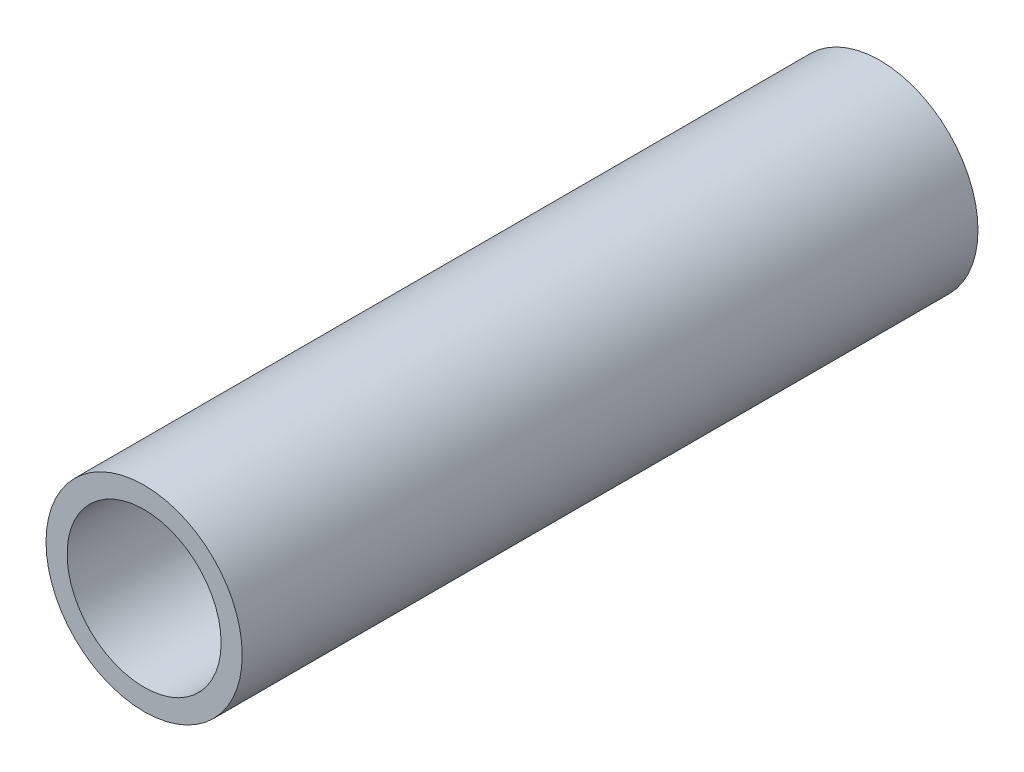
ISO-10303-21;
HEADER;
FILE_DESCRIPTION(('STEP AP214'),'2;1');
FILE_NAME('part.step','',(''),(''),'','','');
FILE_SCHEMA(('AUTOMOTIVE_DESIGN { 1 0 10303 214 1 1 1 1 }'));
ENDSEC;
DATA;
#1=APPLICATION_CONTEXT('core data for automotive mechanical design processes');
#2=APPLICATION_PROTOCOL_DEFINITION('international standard','automotive_design',2000,#1);
#3=PRODUCT_CONTEXT('',#1,'mechanical');
#4=PRODUCT('Part','Part','',(#3));
#5=PRODUCT_RELATED_PRODUCT_CATEGORY('part','',(#4));
#6=PRODUCT_DEFINITION_FORMATION('','',#4);
#7=PRODUCT_DEFINITION_CONTEXT('part definition',#1,'design');
#8=PRODUCT_DEFINITION('design','',#6,#7);
#9=PRODUCT_DEFINITION_SHAPE('','',#8);
#10=(LENGTH_UNIT() NAMED_UNIT(*) SI_UNIT(.MILLI.,.METRE.));
#11=(NAMED_UNIT(*) PLANE_ANGLE_UNIT() SI_UNIT($,.RADIAN.));
#12=(NAMED_UNIT(*) SI_UNIT($,.STERADIAN.) SOLID_ANGLE_UNIT());
#13=UNCERTAINTY_MEASURE_WITH_UNIT(LENGTH_MEASURE(1.E-05),#10,'distance_accuracy_value','');
#14=(GEOMETRIC_REPRESENTATION_CONTEXT(3) GLOBAL_UNCERTAINTY_ASSIGNED_CONTEXT((#13)) GLOBAL_UNIT_ASSIGNED_CONTEXT((#10,
#11,#12)) REPRESENTATION_CONTEXT('',''));
#15=CARTESIAN_POINT('',(0.,0.,0.));
#16=DIRECTION('',(0.,0.,1.));
#17=DIRECTION('',(1.,0.,0.));
#18=AXIS2_PLACEMENT_3D('',#15,#16,#17);
#19=CARTESIAN_POINT('',(0.,0.,49.999999949));
#20=DIRECTION('',(0.,0.,1.));
#21=DIRECTION('',(1.,0.,0.));
#22=AXIS2_PLACEMENT_3D('',#19,#20,#21);
#23=PLANE('',#22);
#24=CARTESIAN_POINT('',(0.,0.,49.999999949));
#25=DIRECTION('',(0.,0.,1.));
#26=DIRECTION('',(1.,0.,0.));
#27=AXIS2_PLACEMENT_3D('',#24,#25,#26);
#28=CIRCLE('',#27,13.335);
#29=CARTESIAN_POINT('',(13.335,0.,49.999999949));
#30=VERTEX_POINT('',#29);
#31=EDGE_CURVE('E10',#30,#30,#28,.T.);
#32=ORIENTED_EDGE('',*,*,#31,.T.);
#33=EDGE_LOOP('',(#32));
#34=FACE_BOUND('',#33,.T.);
#35=CARTESIAN_POINT('',(0.,0.,49.999999949));
#36=DIRECTION('',(0.,0.,1.));
#37=DIRECTION('',(1.,0.,0.));
#38=AXIS2_PLACEMENT_3D('',#35,#36,#37);
#39=CIRCLE('',#38,10.4648);
#40=CARTESIAN_POINT('',(10.4648,0.,49.999999949));
#41=VERTEX_POINT('',#40);
#42=EDGE_CURVE('E38',#41,#41,#39,.T.);
#43=ORIENTED_EDGE('',*,*,#42,.F.);
#44=EDGE_LOOP('',(#43));
#45=FACE_BOUND('',#44,.T.);
#46=ADVANCED_FACE('F31',(#34,#45),#23,.T.);
#47=CARTESIAN_POINT('',(0.,0.,49.999999949));
#48=DIRECTION('',(0.,0.,-1.));
#49=DIRECTION('',(-1.,0.,0.));
#50=AXIS2_PLACEMENT_3D('',#47,#48,#49);
#51=CYLINDRICAL_SURFACE('',#50,13.335);
#52=ORIENTED_EDGE('',*,*,#31,.F.);
#53=EDGE_LOOP('',(#52));
#54=FACE_BOUND('',#53,.T.);
#55=CARTESIAN_POINT('',(0.,0.,-49.999999949));
#56=DIRECTION('',(0.,0.,1.));
#57=DIRECTION('',(1.,0.,0.));
#58=AXIS2_PLACEMENT_3D('',#55,#56,#57);
#59=CIRCLE('',#58,13.335);
#60=CARTESIAN_POINT('',(13.335,0.,-49.999999949));
#61=VERTEX_POINT('',#60);
#62=EDGE_CURVE('E42',#61,#61,#59,.T.);
#63=ORIENTED_EDGE('',*,*,#62,.T.);
#64=EDGE_LOOP('',(#63));
#65=FACE_BOUND('',#64,.T.);
#66=ADVANCED_FACE('F33',(#54,#65),#51,.T.);
#67=CARTESIAN_POINT('',(0.,0.,49.999999949));
#68=DIRECTION('',(0.,0.,-1.));
#69=DIRECTION('',(-1.,0.,0.));
#70=AXIS2_PLACEMENT_3D('',#67,#68,#69);
#71=CYLINDRICAL_SURFACE('',#70,10.4648);
#72=ORIENTED_EDGE('',*,*,#42,.T.);
#73=EDGE_LOOP('',(#72));
#74=FACE_BOUND('',#73,.T.);
#75=CARTESIAN_POINT('',(0.,0.,-49.999999949));
#76=DIRECTION('',(0.,0.,1.));
#77=DIRECTION('',(1.,0.,0.));
#78=AXIS2_PLACEMENT_3D('',#75,#76,#77);
#79=CIRCLE('',#78,10.4648);
#80=CARTESIAN_POINT('',(10.4648,0.,-49.999999949));
#81=VERTEX_POINT('',#80);
#82=EDGE_CURVE('E46',#81,#81,#79,.T.);
#83=ORIENTED_EDGE('',*,*,#82,.F.);
#84=EDGE_LOOP('',(#83));
#85=FACE_BOUND('',#84,.T.);
#86=ADVANCED_FACE('F55',(#74,#85),#71,.F.);
#87=CARTESIAN_POINT('',(0.,0.,-49.999999949));
#88=DIRECTION('',(0.,0.,1.));
#89=DIRECTION('',(1.,0.,0.));
#90=AXIS2_PLACEMENT_3D('',#87,#88,#89);
#91=PLANE('',#90);
#92=ORIENTED_EDGE('',*,*,#82,.T.);
#93=EDGE_LOOP('',(#92));
#94=FACE_BOUND('',#93,.T.);
#95=ORIENTED_EDGE('',*,*,#62,.F.);
#96=EDGE_LOOP('',(#95));
#97=FACE_BOUND('',#96,.T.);
#98=ADVANCED_FACE('F52',(#94,#97),#91,.F.);
#99=CLOSED_SHELL('',(#46,#66,#86,#98));
#100=MANIFOLD_SOLID_BREP('B2',#99);
#101=ADVANCED_BREP_SHAPE_REPRESENTATION('',(#18,#100),#14);
#102=SHAPE_DEFINITION_REPRESENTATION(#9,#101);
ENDSEC;
END-ISO-10303-21;
